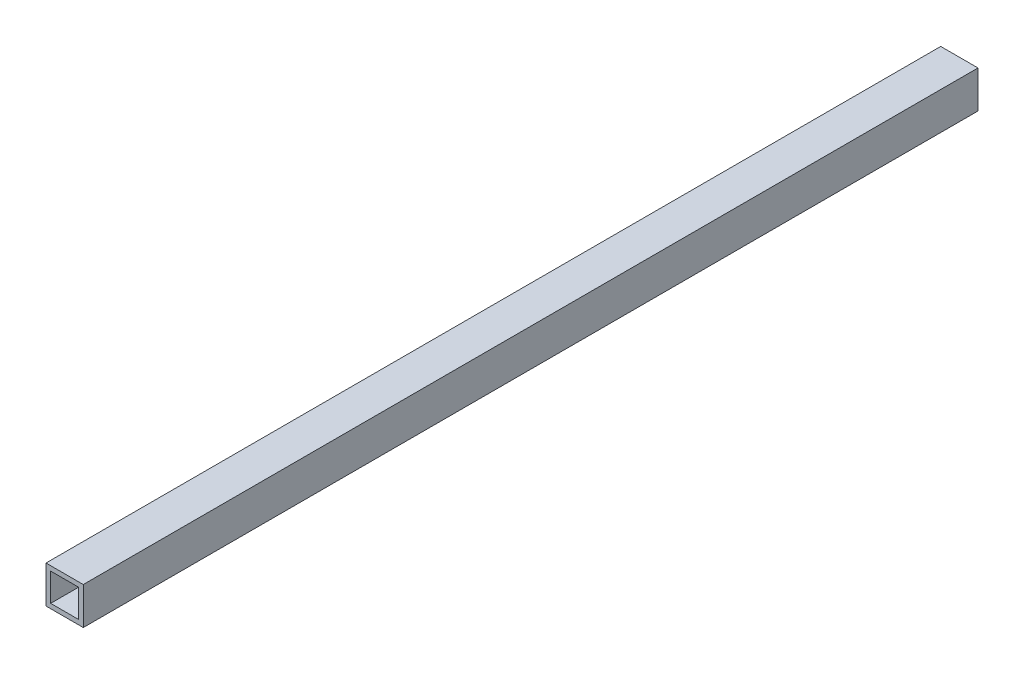
ISO-10303-21;
HEADER;
FILE_DESCRIPTION(('STEP AP214'),'2;1');
FILE_NAME('part.step','',(''),(''),'','','');
FILE_SCHEMA(('AUTOMOTIVE_DESIGN { 1 0 10303 214 1 1 1 1 }'));
ENDSEC;
DATA;
#1=APPLICATION_CONTEXT('core data for automotive mechanical design processes');
#2=APPLICATION_PROTOCOL_DEFINITION('international standard','automotive_design',2000,#1);
#3=PRODUCT_CONTEXT('',#1,'mechanical');
#4=PRODUCT('Part','Part','',(#3));
#5=PRODUCT_RELATED_PRODUCT_CATEGORY('part','',(#4));
#6=PRODUCT_DEFINITION_FORMATION('','',#4);
#7=PRODUCT_DEFINITION_CONTEXT('part definition',#1,'design');
#8=PRODUCT_DEFINITION('design','',#6,#7);
#9=PRODUCT_DEFINITION_SHAPE('','',#8);
#10=(LENGTH_UNIT() NAMED_UNIT(*) SI_UNIT(.MILLI.,.METRE.));
#11=(NAMED_UNIT(*) PLANE_ANGLE_UNIT() SI_UNIT($,.RADIAN.));
#12=(NAMED_UNIT(*) SI_UNIT($,.STERADIAN.) SOLID_ANGLE_UNIT());
#13=UNCERTAINTY_MEASURE_WITH_UNIT(LENGTH_MEASURE(1.E-05),#10,'distance_accuracy_value','');
#14=(GEOMETRIC_REPRESENTATION_CONTEXT(3) GLOBAL_UNCERTAINTY_ASSIGNED_CONTEXT((#13)) GLOBAL_UNIT_ASSIGNED_CONTEXT((#10,
#11,#12)) REPRESENTATION_CONTEXT('',''));
#15=CARTESIAN_POINT('',(0.,0.,0.));
#16=DIRECTION('',(0.,0.,1.));
#17=DIRECTION('',(1.,0.,0.));
#18=AXIS2_PLACEMENT_3D('',#15,#16,#17);
#19=CARTESIAN_POINT('',(0.,0.,609.6));
#20=DIRECTION('',(0.,0.,1.));
#21=DIRECTION('',(1.,0.,0.));
#22=AXIS2_PLACEMENT_3D('',#19,#20,#21);
#23=PLANE('',#22);
#24=DIRECTION('',(0.,1.,0.));
#25=VECTOR('',#24,1.);
#26=CARTESIAN_POINT('',(12.7,12.7,609.6));
#27=LINE('',#26,#25);
#28=CARTESIAN_POINT('',(12.7,-12.7,609.6));
#29=VERTEX_POINT('',#28);
#30=CARTESIAN_POINT('',(12.7,12.7,609.6));
#31=VERTEX_POINT('',#30);
#32=EDGE_CURVE('E134',#29,#31,#27,.T.);
#33=ORIENTED_EDGE('',*,*,#32,.T.);
#34=DIRECTION('',(-1.,0.,0.));
#35=VECTOR('',#34,1.);
#36=CARTESIAN_POINT('',(-12.7,12.7,609.6));
#37=LINE('',#36,#35);
#38=CARTESIAN_POINT('',(-12.7,12.7,609.6));
#39=VERTEX_POINT('',#38);
#40=EDGE_CURVE('E137',#31,#39,#37,.T.);
#41=ORIENTED_EDGE('',*,*,#40,.T.);
#42=DIRECTION('',(0.,-1.,0.));
#43=VECTOR('',#42,1.);
#44=CARTESIAN_POINT('',(-12.7,12.7,609.6));
#45=LINE('',#44,#43);
#46=CARTESIAN_POINT('',(-12.7,-12.7,609.6));
#47=VERTEX_POINT('',#46);
#48=EDGE_CURVE('E140',#39,#47,#45,.T.);
#49=ORIENTED_EDGE('',*,*,#48,.T.);
#50=DIRECTION('',(1.,0.,0.));
#51=VECTOR('',#50,1.);
#52=CARTESIAN_POINT('',(-12.7,-12.7,609.6));
#53=LINE('',#52,#51);
#54=EDGE_CURVE('E142',#47,#29,#53,.T.);
#55=ORIENTED_EDGE('',*,*,#54,.T.);
#56=EDGE_LOOP('',(#33,#41,#49,#55));
#57=FACE_BOUND('',#56,.T.);
#58=DIRECTION('',(-1.,0.,0.));
#59=VECTOR('',#58,1.);
#60=CARTESIAN_POINT('',(-9.52500000000001,9.525,609.6));
#61=LINE('',#60,#59);
#62=CARTESIAN_POINT('',(9.525,9.525,609.6));
#63=VERTEX_POINT('',#62);
#64=CARTESIAN_POINT('',(-9.52500000000001,9.525,609.6));
#65=VERTEX_POINT('',#64);
#66=EDGE_CURVE('E106',#63,#65,#61,.T.);
#67=ORIENTED_EDGE('',*,*,#66,.F.);
#68=DIRECTION('',(0.,1.,0.));
#69=VECTOR('',#68,1.);
#70=CARTESIAN_POINT('',(9.525,-9.525,609.6));
#71=LINE('',#70,#69);
#72=CARTESIAN_POINT('',(9.525,-9.525,609.6));
#73=VERTEX_POINT('',#72);
#74=EDGE_CURVE('E98',#73,#63,#71,.T.);
#75=ORIENTED_EDGE('',*,*,#74,.F.);
#76=DIRECTION('',(1.,0.,0.));
#77=VECTOR('',#76,1.);
#78=CARTESIAN_POINT('',(-9.52500000000001,-9.525,609.6));
#79=LINE('',#78,#77);
#80=CARTESIAN_POINT('',(-9.52500000000001,-9.525,609.6));
#81=VERTEX_POINT('',#80);
#82=EDGE_CURVE('E120',#81,#73,#79,.T.);
#83=ORIENTED_EDGE('',*,*,#82,.F.);
#84=DIRECTION('',(0.,-1.,0.));
#85=VECTOR('',#84,1.);
#86=CARTESIAN_POINT('',(-9.52500000000001,-9.525,609.6));
#87=LINE('',#86,#85);
#88=EDGE_CURVE('E118',#65,#81,#87,.T.);
#89=ORIENTED_EDGE('',*,*,#88,.F.);
#90=EDGE_LOOP('',(#67,#75,#83,#89));
#91=FACE_BOUND('',#90,.T.);
#92=ADVANCED_FACE('F33',(#57,#91),#23,.T.);
#93=CARTESIAN_POINT('',(0.,0.,0.));
#94=DIRECTION('',(0.,0.,1.));
#95=DIRECTION('',(1.,0.,0.));
#96=AXIS2_PLACEMENT_3D('',#93,#94,#95);
#97=PLANE('',#96);
#98=DIRECTION('',(0.,1.,0.));
#99=VECTOR('',#98,1.);
#100=CARTESIAN_POINT('',(12.7,12.7,0.));
#101=LINE('',#100,#99);
#102=CARTESIAN_POINT('',(12.7,-12.7,0.));
#103=VERTEX_POINT('',#102);
#104=CARTESIAN_POINT('',(12.7,12.7,0.));
#105=VERTEX_POINT('',#104);
#106=EDGE_CURVE('E114',#103,#105,#101,.T.);
#107=ORIENTED_EDGE('',*,*,#106,.F.);
#108=DIRECTION('',(1.,0.,0.));
#109=VECTOR('',#108,1.);
#110=CARTESIAN_POINT('',(-12.7,-12.7,0.));
#111=LINE('',#110,#109);
#112=CARTESIAN_POINT('',(-12.7,-12.7,0.));
#113=VERTEX_POINT('',#112);
#114=EDGE_CURVE('E138',#113,#103,#111,.T.);
#115=ORIENTED_EDGE('',*,*,#114,.F.);
#116=DIRECTION('',(0.,-1.,0.));
#117=VECTOR('',#116,1.);
#118=CARTESIAN_POINT('',(-12.7,12.7,0.));
#119=LINE('',#118,#117);
#120=CARTESIAN_POINT('',(-12.7,12.7,0.));
#121=VERTEX_POINT('',#120);
#122=EDGE_CURVE('E149',#121,#113,#119,.T.);
#123=ORIENTED_EDGE('',*,*,#122,.F.);
#124=DIRECTION('',(-1.,0.,0.));
#125=VECTOR('',#124,1.);
#126=CARTESIAN_POINT('',(-12.7,12.7,0.));
#127=LINE('',#126,#125);
#128=EDGE_CURVE('E147',#105,#121,#127,.T.);
#129=ORIENTED_EDGE('',*,*,#128,.F.);
#130=EDGE_LOOP('',(#107,#115,#123,#129));
#131=FACE_BOUND('',#130,.T.);
#132=DIRECTION('',(0.,1.,0.));
#133=VECTOR('',#132,1.);
#134=CARTESIAN_POINT('',(9.525,-9.525,0.));
#135=LINE('',#134,#133);
#136=CARTESIAN_POINT('',(9.525,-9.525,0.));
#137=VERTEX_POINT('',#136);
#138=CARTESIAN_POINT('',(9.525,9.525,0.));
#139=VERTEX_POINT('',#138);
#140=EDGE_CURVE('E56',#137,#139,#135,.T.);
#141=ORIENTED_EDGE('',*,*,#140,.T.);
#142=DIRECTION('',(-1.,0.,0.));
#143=VECTOR('',#142,1.);
#144=CARTESIAN_POINT('',(-9.52500000000001,9.525,0.));
#145=LINE('',#144,#143);
#146=CARTESIAN_POINT('',(-9.52500000000001,9.525,0.));
#147=VERTEX_POINT('',#146);
#148=EDGE_CURVE('E113',#139,#147,#145,.T.);
#149=ORIENTED_EDGE('',*,*,#148,.T.);
#150=DIRECTION('',(0.,-1.,0.));
#151=VECTOR('',#150,1.);
#152=CARTESIAN_POINT('',(-9.52500000000001,-9.525,0.));
#153=LINE('',#152,#151);
#154=CARTESIAN_POINT('',(-9.52500000000001,-9.525,0.));
#155=VERTEX_POINT('',#154);
#156=EDGE_CURVE('E126',#147,#155,#153,.T.);
#157=ORIENTED_EDGE('',*,*,#156,.T.);
#158=DIRECTION('',(1.,0.,0.));
#159=VECTOR('',#158,1.);
#160=CARTESIAN_POINT('',(-9.52500000000001,-9.525,0.));
#161=LINE('',#160,#159);
#162=EDGE_CURVE('E107',#155,#137,#161,.T.);
#163=ORIENTED_EDGE('',*,*,#162,.T.);
#164=EDGE_LOOP('',(#141,#149,#157,#163));
#165=FACE_BOUND('',#164,.T.);
#166=ADVANCED_FACE('F167',(#131,#165),#97,.F.);
#167=CARTESIAN_POINT('',(12.7,12.7,609.6));
#168=DIRECTION('',(-1.,0.,0.));
#169=DIRECTION('',(0.,-1.,0.));
#170=AXIS2_PLACEMENT_3D('',#167,#168,#169);
#171=PLANE('',#170);
#172=ORIENTED_EDGE('',*,*,#106,.T.);
#173=DIRECTION('',(0.,0.,-1.));
#174=VECTOR('',#173,1.);
#175=CARTESIAN_POINT('',(12.7,12.7,609.6));
#176=LINE('',#175,#174);
#177=EDGE_CURVE('E11',#31,#105,#176,.T.);
#178=ORIENTED_EDGE('',*,*,#177,.F.);
#179=ORIENTED_EDGE('',*,*,#32,.F.);
#180=DIRECTION('',(0.,0.,-1.));
#181=VECTOR('',#180,1.);
#182=CARTESIAN_POINT('',(12.7,-12.7,609.6));
#183=LINE('',#182,#181);
#184=EDGE_CURVE('E144',#29,#103,#183,.T.);
#185=ORIENTED_EDGE('',*,*,#184,.T.);
#186=EDGE_LOOP('',(#172,#178,#179,#185));
#187=FACE_BOUND('',#186,.T.);
#188=ADVANCED_FACE('F35',(#187),#171,.F.);
#189=CARTESIAN_POINT('',(-12.7,12.7,609.6));
#190=DIRECTION('',(0.,-1.,0.));
#191=DIRECTION('',(0.,0.,-1.));
#192=AXIS2_PLACEMENT_3D('',#189,#190,#191);
#193=PLANE('',#192);
#194=ORIENTED_EDGE('',*,*,#128,.T.);
#195=DIRECTION('',(0.,0.,-1.));
#196=VECTOR('',#195,1.);
#197=CARTESIAN_POINT('',(-12.7,12.7,609.6));
#198=LINE('',#197,#196);
#199=EDGE_CURVE('E41',#39,#121,#198,.T.);
#200=ORIENTED_EDGE('',*,*,#199,.F.);
#201=ORIENTED_EDGE('',*,*,#40,.F.);
#202=ORIENTED_EDGE('',*,*,#177,.T.);
#203=EDGE_LOOP('',(#194,#200,#201,#202));
#204=FACE_BOUND('',#203,.T.);
#205=ADVANCED_FACE('F177',(#204),#193,.F.);
#206=CARTESIAN_POINT('',(-12.7,12.7,609.6));
#207=DIRECTION('',(1.,0.,0.));
#208=DIRECTION('',(0.,1.,0.));
#209=AXIS2_PLACEMENT_3D('',#206,#207,#208);
#210=PLANE('',#209);
#211=ORIENTED_EDGE('',*,*,#122,.T.);
#212=DIRECTION('',(0.,0.,-1.));
#213=VECTOR('',#212,1.);
#214=CARTESIAN_POINT('',(-12.7,-12.7,609.6));
#215=LINE('',#214,#213);
#216=EDGE_CURVE('E154',#47,#113,#215,.T.);
#217=ORIENTED_EDGE('',*,*,#216,.F.);
#218=ORIENTED_EDGE('',*,*,#48,.F.);
#219=ORIENTED_EDGE('',*,*,#199,.T.);
#220=EDGE_LOOP('',(#211,#217,#218,#219));
#221=FACE_BOUND('',#220,.T.);
#222=ADVANCED_FACE('F161',(#221),#210,.F.);
#223=CARTESIAN_POINT('',(-12.7,-12.7,609.6));
#224=DIRECTION('',(0.,1.,0.));
#225=DIRECTION('',(0.,0.,1.));
#226=AXIS2_PLACEMENT_3D('',#223,#224,#225);
#227=PLANE('',#226);
#228=ORIENTED_EDGE('',*,*,#114,.T.);
#229=ORIENTED_EDGE('',*,*,#184,.F.);
#230=ORIENTED_EDGE('',*,*,#54,.F.);
#231=ORIENTED_EDGE('',*,*,#216,.T.);
#232=EDGE_LOOP('',(#228,#229,#230,#231));
#233=FACE_BOUND('',#232,.T.);
#234=ADVANCED_FACE('F171',(#233),#227,.F.);
#235=CARTESIAN_POINT('',(9.525,-9.525,609.6));
#236=DIRECTION('',(-1.,0.,0.));
#237=DIRECTION('',(0.,0.,1.));
#238=AXIS2_PLACEMENT_3D('',#235,#236,#237);
#239=PLANE('',#238);
#240=ORIENTED_EDGE('',*,*,#140,.F.);
#241=DIRECTION('',(0.,0.,-1.));
#242=VECTOR('',#241,1.);
#243=CARTESIAN_POINT('',(9.525,-9.525,609.6));
#244=LINE('',#243,#242);
#245=EDGE_CURVE('E102',#73,#137,#244,.T.);
#246=ORIENTED_EDGE('',*,*,#245,.F.);
#247=ORIENTED_EDGE('',*,*,#74,.T.);
#248=DIRECTION('',(0.,0.,-1.));
#249=VECTOR('',#248,1.);
#250=CARTESIAN_POINT('',(9.525,9.525,609.6));
#251=LINE('',#250,#249);
#252=EDGE_CURVE('E101',#63,#139,#251,.T.);
#253=ORIENTED_EDGE('',*,*,#252,.T.);
#254=EDGE_LOOP('',(#240,#246,#247,#253));
#255=FACE_BOUND('',#254,.T.);
#256=ADVANCED_FACE('F100',(#255),#239,.T.);
#257=CARTESIAN_POINT('',(-9.52500000000001,9.525,609.6));
#258=DIRECTION('',(0.,-1.,0.));
#259=DIRECTION('',(0.,0.,-1.));
#260=AXIS2_PLACEMENT_3D('',#257,#258,#259);
#261=PLANE('',#260);
#262=ORIENTED_EDGE('',*,*,#148,.F.);
#263=ORIENTED_EDGE('',*,*,#252,.F.);
#264=ORIENTED_EDGE('',*,*,#66,.T.);
#265=DIRECTION('',(0.,0.,-1.));
#266=VECTOR('',#265,1.);
#267=CARTESIAN_POINT('',(-9.52500000000001,9.525,609.6));
#268=LINE('',#267,#266);
#269=EDGE_CURVE('E115',#65,#147,#268,.T.);
#270=ORIENTED_EDGE('',*,*,#269,.T.);
#271=EDGE_LOOP('',(#262,#263,#264,#270));
#272=FACE_BOUND('',#271,.T.);
#273=ADVANCED_FACE('F110',(#272),#261,.T.);
#274=CARTESIAN_POINT('',(-9.52500000000001,-9.525,609.6));
#275=DIRECTION('',(1.,0.,0.));
#276=DIRECTION('',(0.,0.,-1.));
#277=AXIS2_PLACEMENT_3D('',#274,#275,#276);
#278=PLANE('',#277);
#279=ORIENTED_EDGE('',*,*,#156,.F.);
#280=ORIENTED_EDGE('',*,*,#269,.F.);
#281=ORIENTED_EDGE('',*,*,#88,.T.);
#282=DIRECTION('',(0.,0.,-1.));
#283=VECTOR('',#282,1.);
#284=CARTESIAN_POINT('',(-9.52500000000001,-9.525,609.6));
#285=LINE('',#284,#283);
#286=EDGE_CURVE('E48',#81,#155,#285,.T.);
#287=ORIENTED_EDGE('',*,*,#286,.T.);
#288=EDGE_LOOP('',(#279,#280,#281,#287));
#289=FACE_BOUND('',#288,.T.);
#290=ADVANCED_FACE('F200',(#289),#278,.T.);
#291=CARTESIAN_POINT('',(-9.52500000000001,-9.525,609.6));
#292=DIRECTION('',(0.,1.,0.));
#293=DIRECTION('',(0.,0.,1.));
#294=AXIS2_PLACEMENT_3D('',#291,#292,#293);
#295=PLANE('',#294);
#296=ORIENTED_EDGE('',*,*,#162,.F.);
#297=ORIENTED_EDGE('',*,*,#286,.F.);
#298=ORIENTED_EDGE('',*,*,#82,.T.);
#299=ORIENTED_EDGE('',*,*,#245,.T.);
#300=EDGE_LOOP('',(#296,#297,#298,#299));
#301=FACE_BOUND('',#300,.T.);
#302=ADVANCED_FACE('F204',(#301),#295,.T.);
#303=CLOSED_SHELL('',(#92,#166,#188,#205,#222,#234,#256,#273,#290,#302));
#304=MANIFOLD_SOLID_BREP('B2',#303);
#305=ADVANCED_BREP_SHAPE_REPRESENTATION('',(#18,#304),#14);
#306=SHAPE_DEFINITION_REPRESENTATION(#9,#305);
ENDSEC;
END-ISO-10303-21;
